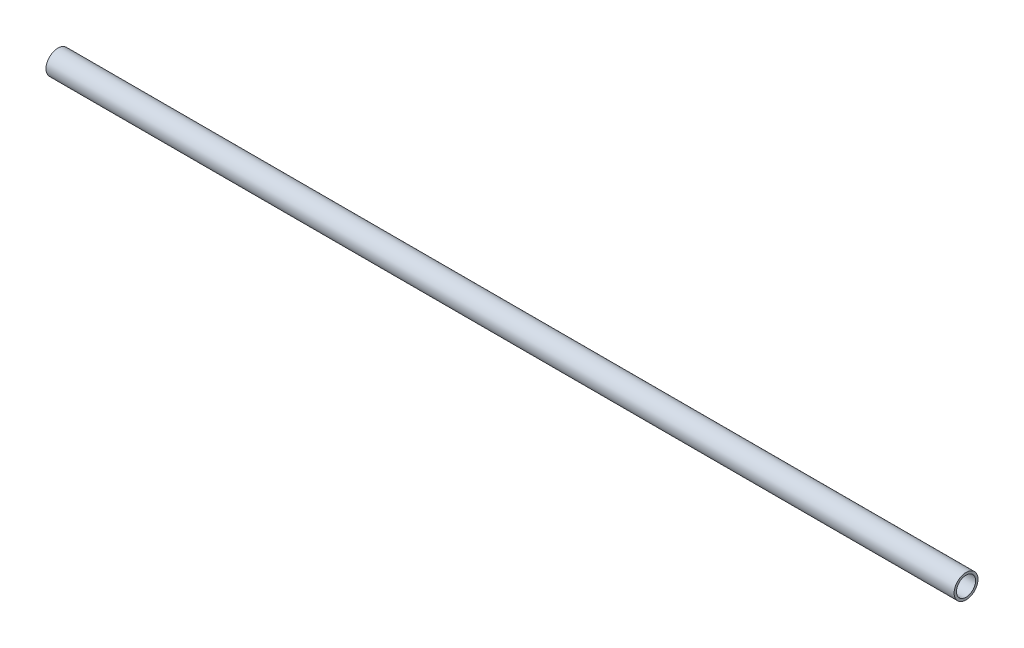
ISO-10303-21;
HEADER;
FILE_DESCRIPTION(('STEP AP214'),'2;1');
FILE_NAME('part.step','',(''),(''),'','','');
FILE_SCHEMA(('AUTOMOTIVE_DESIGN { 1 0 10303 214 1 1 1 1 }'));
ENDSEC;
DATA;
#1=APPLICATION_CONTEXT('core data for automotive mechanical design processes');
#2=APPLICATION_PROTOCOL_DEFINITION('international standard','automotive_design',2000,#1);
#3=PRODUCT_CONTEXT('',#1,'mechanical');
#4=PRODUCT('Part','Part','',(#3));
#5=PRODUCT_RELATED_PRODUCT_CATEGORY('part','',(#4));
#6=PRODUCT_DEFINITION_FORMATION('','',#4);
#7=PRODUCT_DEFINITION_CONTEXT('part definition',#1,'design');
#8=PRODUCT_DEFINITION('design','',#6,#7);
#9=PRODUCT_DEFINITION_SHAPE('','',#8);
#10=(LENGTH_UNIT() NAMED_UNIT(*) SI_UNIT(.MILLI.,.METRE.));
#11=(NAMED_UNIT(*) PLANE_ANGLE_UNIT() SI_UNIT($,.RADIAN.));
#12=(NAMED_UNIT(*) SI_UNIT($,.STERADIAN.) SOLID_ANGLE_UNIT());
#13=UNCERTAINTY_MEASURE_WITH_UNIT(LENGTH_MEASURE(1.E-05),#10,'distance_accuracy_value','');
#14=(GEOMETRIC_REPRESENTATION_CONTEXT(3) GLOBAL_UNCERTAINTY_ASSIGNED_CONTEXT((#13)) GLOBAL_UNIT_ASSIGNED_CONTEXT((#10,
#11,#12)) REPRESENTATION_CONTEXT('',''));
#15=CARTESIAN_POINT('',(0.,0.,0.));
#16=DIRECTION('',(0.,0.,1.));
#17=DIRECTION('',(1.,0.,0.));
#18=AXIS2_PLACEMENT_3D('',#15,#16,#17);
#19=CARTESIAN_POINT('',(95.,0.,0.));
#20=DIRECTION('',(1.,0.,0.));
#21=DIRECTION('',(0.,0.,-1.));
#22=AXIS2_PLACEMENT_3D('',#19,#20,#21);
#23=PLANE('',#22);
#24=CARTESIAN_POINT('',(95.,0.,0.));
#25=DIRECTION('',(1.,0.,0.));
#26=DIRECTION('',(0.,0.,-1.));
#27=AXIS2_PLACEMENT_3D('',#24,#25,#26);
#28=CIRCLE('',#27,2.5);
#29=CARTESIAN_POINT('',(95.,0.,-2.5));
#30=VERTEX_POINT('',#29);
#31=EDGE_CURVE('E10',#30,#30,#28,.T.);
#32=ORIENTED_EDGE('',*,*,#31,.T.);
#33=EDGE_LOOP('',(#32));
#34=FACE_BOUND('',#33,.T.);
#35=CARTESIAN_POINT('',(95.,0.,0.));
#36=DIRECTION('',(1.,0.,0.));
#37=DIRECTION('',(0.,0.,-1.));
#38=AXIS2_PLACEMENT_3D('',#35,#36,#37);
#39=CIRCLE('',#38,2.);
#40=CARTESIAN_POINT('',(95.,0.,-2.));
#41=VERTEX_POINT('',#40);
#42=EDGE_CURVE('E42',#41,#41,#39,.T.);
#43=ORIENTED_EDGE('',*,*,#42,.F.);
#44=EDGE_LOOP('',(#43));
#45=FACE_BOUND('',#44,.T.);
#46=ADVANCED_FACE('F31',(#34,#45),#23,.T.);
#47=CARTESIAN_POINT('',(-95.,0.,0.));
#48=DIRECTION('',(1.,0.,0.));
#49=DIRECTION('',(0.,0.,-1.));
#50=AXIS2_PLACEMENT_3D('',#47,#48,#49);
#51=PLANE('',#50);
#52=CARTESIAN_POINT('',(-95.,0.,0.));
#53=DIRECTION('',(1.,0.,0.));
#54=DIRECTION('',(0.,0.,-1.));
#55=AXIS2_PLACEMENT_3D('',#52,#53,#54);
#56=CIRCLE('',#55,2.5);
#57=CARTESIAN_POINT('',(-95.,0.,-2.5));
#58=VERTEX_POINT('',#57);
#59=EDGE_CURVE('E35',#58,#58,#56,.T.);
#60=ORIENTED_EDGE('',*,*,#59,.F.);
#61=EDGE_LOOP('',(#60));
#62=FACE_BOUND('',#61,.T.);
#63=CARTESIAN_POINT('',(-95.,0.,0.));
#64=DIRECTION('',(1.,0.,0.));
#65=DIRECTION('',(0.,0.,-1.));
#66=AXIS2_PLACEMENT_3D('',#63,#64,#65);
#67=CIRCLE('',#66,2.);
#68=CARTESIAN_POINT('',(-95.,0.,-2.));
#69=VERTEX_POINT('',#68);
#70=EDGE_CURVE('E44',#69,#69,#67,.T.);
#71=ORIENTED_EDGE('',*,*,#70,.T.);
#72=EDGE_LOOP('',(#71));
#73=FACE_BOUND('',#72,.T.);
#74=ADVANCED_FACE('F54',(#62,#73),#51,.F.);
#75=CARTESIAN_POINT('',(95.,0.,0.));
#76=DIRECTION('',(-1.,0.,0.));
#77=DIRECTION('',(0.,0.,1.));
#78=AXIS2_PLACEMENT_3D('',#75,#76,#77);
#79=CYLINDRICAL_SURFACE('',#78,2.5);
#80=ORIENTED_EDGE('',*,*,#31,.F.);
#81=EDGE_LOOP('',(#80));
#82=FACE_BOUND('',#81,.T.);
#83=ORIENTED_EDGE('',*,*,#59,.T.);
#84=EDGE_LOOP('',(#83));
#85=FACE_BOUND('',#84,.T.);
#86=ADVANCED_FACE('F33',(#82,#85),#79,.T.);
#87=CARTESIAN_POINT('',(95.,0.,0.));
#88=DIRECTION('',(-1.,0.,0.));
#89=DIRECTION('',(0.,0.,1.));
#90=AXIS2_PLACEMENT_3D('',#87,#88,#89);
#91=CYLINDRICAL_SURFACE('',#90,2.);
#92=ORIENTED_EDGE('',*,*,#42,.T.);
#93=EDGE_LOOP('',(#92));
#94=FACE_BOUND('',#93,.T.);
#95=ORIENTED_EDGE('',*,*,#70,.F.);
#96=EDGE_LOOP('',(#95));
#97=FACE_BOUND('',#96,.T.);
#98=ADVANCED_FACE('F50',(#94,#97),#91,.F.);
#99=CLOSED_SHELL('',(#46,#74,#86,#98));
#100=MANIFOLD_SOLID_BREP('B2',#99);
#101=ADVANCED_BREP_SHAPE_REPRESENTATION('',(#18,#100),#14);
#102=SHAPE_DEFINITION_REPRESENTATION(#9,#101);
ENDSEC;
END-ISO-10303-21;
